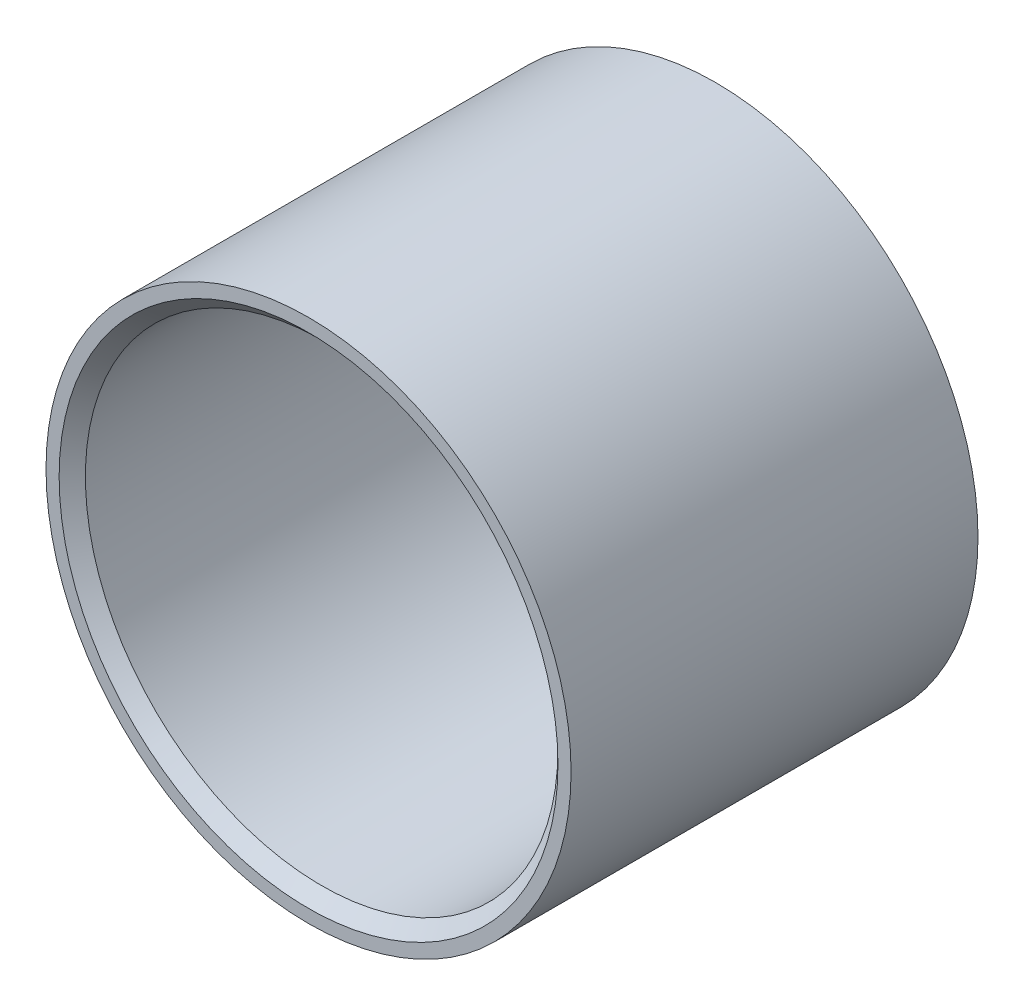
ISO-10303-21;
HEADER;
FILE_DESCRIPTION(('STEP AP214'),'2;1');
FILE_NAME('part.step','',(''),(''),'','','');
FILE_SCHEMA(('AUTOMOTIVE_DESIGN { 1 0 10303 214 1 1 1 1 }'));
ENDSEC;
DATA;
#1=APPLICATION_CONTEXT('core data for automotive mechanical design processes');
#2=APPLICATION_PROTOCOL_DEFINITION('international standard','automotive_design',2000,#1);
#3=PRODUCT_CONTEXT('',#1,'mechanical');
#4=PRODUCT('Part','Part','',(#3));
#5=PRODUCT_RELATED_PRODUCT_CATEGORY('part','',(#4));
#6=PRODUCT_DEFINITION_FORMATION('','',#4);
#7=PRODUCT_DEFINITION_CONTEXT('part definition',#1,'design');
#8=PRODUCT_DEFINITION('design','',#6,#7);
#9=PRODUCT_DEFINITION_SHAPE('','',#8);
#10=(LENGTH_UNIT() NAMED_UNIT(*) SI_UNIT(.MILLI.,.METRE.));
#11=(NAMED_UNIT(*) PLANE_ANGLE_UNIT() SI_UNIT($,.RADIAN.));
#12=(NAMED_UNIT(*) SI_UNIT($,.STERADIAN.) SOLID_ANGLE_UNIT());
#13=UNCERTAINTY_MEASURE_WITH_UNIT(LENGTH_MEASURE(1.E-05),#10,'distance_accuracy_value','');
#14=(GEOMETRIC_REPRESENTATION_CONTEXT(3) GLOBAL_UNCERTAINTY_ASSIGNED_CONTEXT((#13)) GLOBAL_UNIT_ASSIGNED_CONTEXT((#10,
#11,#12)) REPRESENTATION_CONTEXT('',''));
#15=CARTESIAN_POINT('',(0.,0.,0.));
#16=DIRECTION('',(0.,0.,1.));
#17=DIRECTION('',(1.,0.,0.));
#18=AXIS2_PLACEMENT_3D('',#15,#16,#17);
#19=CARTESIAN_POINT('',(0.,0.,15.5));
#20=DIRECTION('',(0.,0.,1.));
#21=DIRECTION('',(1.,0.,0.));
#22=AXIS2_PLACEMENT_3D('',#19,#20,#21);
#23=PLANE('',#22);
#24=CARTESIAN_POINT('',(0.,0.,15.5));
#25=DIRECTION('',(0.,0.,1.));
#26=DIRECTION('',(1.,0.,0.));
#27=AXIS2_PLACEMENT_3D('',#24,#25,#26);
#28=CIRCLE('',#27,9.5);
#29=CARTESIAN_POINT('',(9.5,0.,15.5));
#30=VERTEX_POINT('',#29);
#31=EDGE_CURVE('E10',#30,#30,#28,.F.);
#32=ORIENTED_EDGE('',*,*,#31,.T.);
#33=EDGE_LOOP('',(#32));
#34=FACE_BOUND('',#33,.T.);
#35=CARTESIAN_POINT('',(0.,0.,15.5));
#36=DIRECTION('',(0.,0.,1.));
#37=DIRECTION('',(1.,0.,0.));
#38=AXIS2_PLACEMENT_3D('',#35,#36,#37);
#39=CIRCLE('',#38,10.);
#40=CARTESIAN_POINT('',(10.,0.,15.5));
#41=VERTEX_POINT('',#40);
#42=EDGE_CURVE('E58',#41,#41,#39,.T.);
#43=ORIENTED_EDGE('',*,*,#42,.T.);
#44=EDGE_LOOP('',(#43));
#45=FACE_BOUND('',#44,.T.);
#46=ADVANCED_FACE('F37',(#34,#45),#23,.T.);
#47=CARTESIAN_POINT('',(0.,0.,0.));
#48=DIRECTION('',(0.,0.,1.));
#49=DIRECTION('',(1.,0.,0.));
#50=AXIS2_PLACEMENT_3D('',#47,#48,#49);
#51=PLANE('',#50);
#52=CARTESIAN_POINT('',(0.,0.,0.));
#53=DIRECTION('',(0.,0.,1.));
#54=DIRECTION('',(1.,0.,0.));
#55=AXIS2_PLACEMENT_3D('',#52,#53,#54);
#56=CIRCLE('',#55,9.5);
#57=CARTESIAN_POINT('',(9.5,0.,0.));
#58=VERTEX_POINT('',#57);
#59=EDGE_CURVE('E53',#58,#58,#56,.T.);
#60=ORIENTED_EDGE('',*,*,#59,.T.);
#61=EDGE_LOOP('',(#60));
#62=FACE_BOUND('',#61,.T.);
#63=CARTESIAN_POINT('',(0.,0.,0.));
#64=DIRECTION('',(0.,0.,1.));
#65=DIRECTION('',(1.,0.,0.));
#66=AXIS2_PLACEMENT_3D('',#63,#64,#65);
#67=CIRCLE('',#66,10.);
#68=CARTESIAN_POINT('',(10.,0.,0.));
#69=VERTEX_POINT('',#68);
#70=EDGE_CURVE('E59',#69,#69,#67,.T.);
#71=ORIENTED_EDGE('',*,*,#70,.F.);
#72=EDGE_LOOP('',(#71));
#73=FACE_BOUND('',#72,.T.);
#74=ADVANCED_FACE('F70',(#62,#73),#51,.F.);
#75=CARTESIAN_POINT('',(0.,0.,15.5));
#76=DIRECTION('',(0.,0.,-1.));
#77=DIRECTION('',(-1.,0.,0.));
#78=AXIS2_PLACEMENT_3D('',#75,#76,#77);
#79=CYLINDRICAL_SURFACE('',#78,10.);
#80=ORIENTED_EDGE('',*,*,#42,.F.);
#81=EDGE_LOOP('',(#80));
#82=FACE_BOUND('',#81,.T.);
#83=ORIENTED_EDGE('',*,*,#70,.T.);
#84=EDGE_LOOP('',(#83));
#85=FACE_BOUND('',#84,.T.);
#86=ADVANCED_FACE('F66',(#82,#85),#79,.T.);
#87=CARTESIAN_POINT('',(0.,0.,15.5));
#88=DIRECTION('',(0.,0.,-1.));
#89=DIRECTION('',(-1.,0.,0.));
#90=AXIS2_PLACEMENT_3D('',#87,#88,#89);
#91=CYLINDRICAL_SURFACE('',#90,9.);
#92=CARTESIAN_POINT('',(0.,0.,0.499999999999997));
#93=DIRECTION('',(0.,0.,1.));
#94=DIRECTION('',(1.,0.,0.));
#95=AXIS2_PLACEMENT_3D('',#92,#93,#94);
#96=CIRCLE('',#95,9.);
#97=CARTESIAN_POINT('',(9.,0.,0.499999999999997));
#98=VERTEX_POINT('',#97);
#99=EDGE_CURVE('E45',#98,#98,#96,.F.);
#100=ORIENTED_EDGE('',*,*,#99,.T.);
#101=EDGE_LOOP('',(#100));
#102=FACE_BOUND('',#101,.T.);
#103=CARTESIAN_POINT('',(0.,0.,15.));
#104=DIRECTION('',(0.,0.,1.));
#105=DIRECTION('',(1.,0.,0.));
#106=AXIS2_PLACEMENT_3D('',#103,#104,#105);
#107=CIRCLE('',#106,9.);
#108=CARTESIAN_POINT('',(9.,0.,15.));
#109=VERTEX_POINT('',#108);
#110=EDGE_CURVE('E49',#109,#109,#107,.T.);
#111=ORIENTED_EDGE('',*,*,#110,.T.);
#112=EDGE_LOOP('',(#111));
#113=FACE_BOUND('',#112,.T.);
#114=ADVANCED_FACE('F69',(#102,#113),#91,.F.);
#115=CARTESIAN_POINT('',(0.,0.,0.));
#116=DIRECTION('',(0.,0.,-1.));
#117=DIRECTION('',(-1.,0.,0.));
#118=AXIS2_PLACEMENT_3D('',#115,#116,#117);
#119=CONICAL_SURFACE('',#118,9.5,0.785398163397448);
#120=ORIENTED_EDGE('',*,*,#99,.F.);
#121=EDGE_LOOP('',(#120));
#122=FACE_BOUND('',#121,.T.);
#123=ORIENTED_EDGE('',*,*,#59,.F.);
#124=EDGE_LOOP('',(#123));
#125=FACE_BOUND('',#124,.T.);
#126=ADVANCED_FACE('F83',(#122,#125),#119,.F.);
#127=CARTESIAN_POINT('',(0.,0.,15.));
#128=DIRECTION('',(0.,0.,1.));
#129=DIRECTION('',(1.,0.,0.));
#130=AXIS2_PLACEMENT_3D('',#127,#128,#129);
#131=CONICAL_SURFACE('',#130,9.,0.785398163397448);
#132=ORIENTED_EDGE('',*,*,#31,.F.);
#133=EDGE_LOOP('',(#132));
#134=FACE_BOUND('',#133,.T.);
#135=ORIENTED_EDGE('',*,*,#110,.F.);
#136=EDGE_LOOP('',(#135));
#137=FACE_BOUND('',#136,.T.);
#138=ADVANCED_FACE('F40',(#134,#137),#131,.F.);
#139=CLOSED_SHELL('',(#46,#74,#86,#114,#126,#138));
#140=MANIFOLD_SOLID_BREP('B2',#139);
#141=ADVANCED_BREP_SHAPE_REPRESENTATION('',(#18,#140),#14);
#142=SHAPE_DEFINITION_REPRESENTATION(#9,#141);
ENDSEC;
END-ISO-10303-21;
